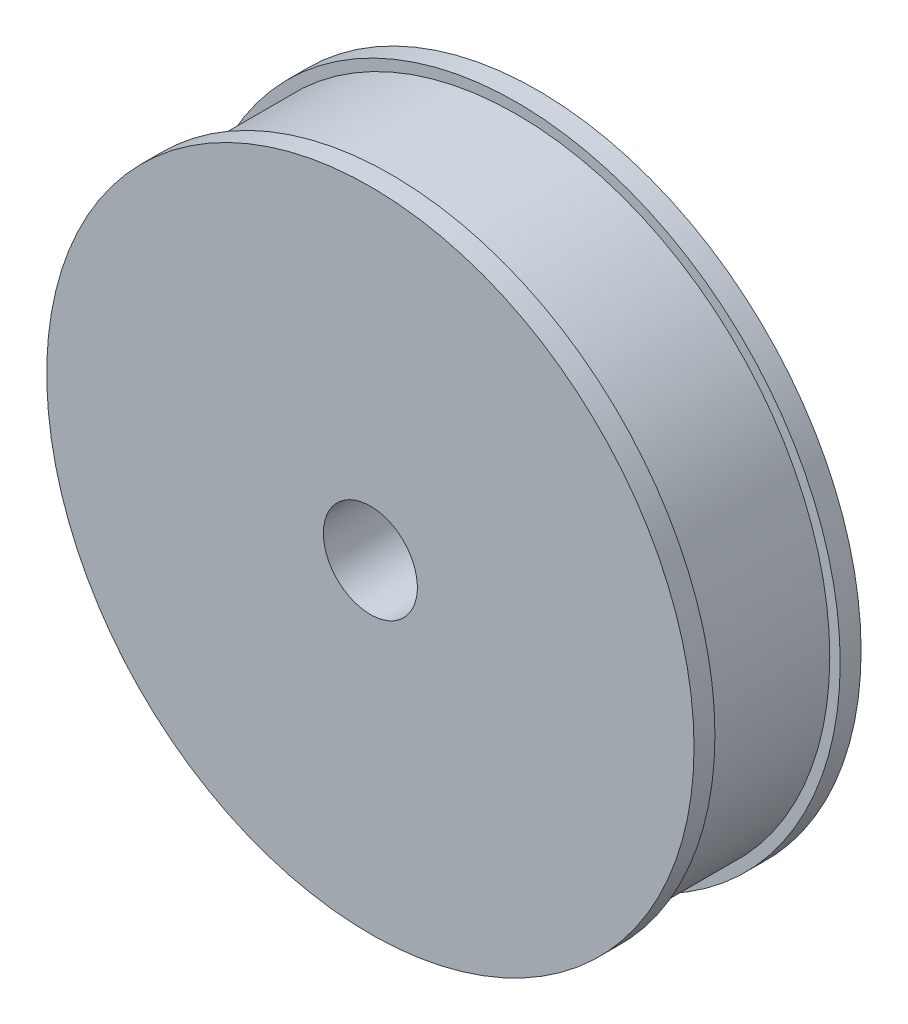
ISO-10303-21;
HEADER;
FILE_DESCRIPTION(('STEP AP214'),'2;1');
FILE_NAME('part.step','',(''),(''),'','','');
FILE_SCHEMA(('AUTOMOTIVE_DESIGN { 1 0 10303 214 1 1 1 1 }'));
ENDSEC;
DATA;
#1=APPLICATION_CONTEXT('core data for automotive mechanical design processes');
#2=APPLICATION_PROTOCOL_DEFINITION('international standard','automotive_design',2000,#1);
#3=PRODUCT_CONTEXT('',#1,'mechanical');
#4=PRODUCT('Part','Part','',(#3));
#5=PRODUCT_RELATED_PRODUCT_CATEGORY('part','',(#4));
#6=PRODUCT_DEFINITION_FORMATION('','',#4);
#7=PRODUCT_DEFINITION_CONTEXT('part definition',#1,'design');
#8=PRODUCT_DEFINITION('design','',#6,#7);
#9=PRODUCT_DEFINITION_SHAPE('','',#8);
#10=(LENGTH_UNIT() NAMED_UNIT(*) SI_UNIT(.MILLI.,.METRE.));
#11=(NAMED_UNIT(*) PLANE_ANGLE_UNIT() SI_UNIT($,.RADIAN.));
#12=(NAMED_UNIT(*) SI_UNIT($,.STERADIAN.) SOLID_ANGLE_UNIT());
#13=UNCERTAINTY_MEASURE_WITH_UNIT(LENGTH_MEASURE(1.E-05),#10,'distance_accuracy_value','');
#14=(GEOMETRIC_REPRESENTATION_CONTEXT(3) GLOBAL_UNCERTAINTY_ASSIGNED_CONTEXT((#13)) GLOBAL_UNIT_ASSIGNED_CONTEXT((#10,
#11,#12)) REPRESENTATION_CONTEXT('',''));
#15=CARTESIAN_POINT('',(0.,0.,0.));
#16=DIRECTION('',(0.,0.,1.));
#17=DIRECTION('',(1.,0.,0.));
#18=AXIS2_PLACEMENT_3D('',#15,#16,#17);
#19=CARTESIAN_POINT('',(0.,0.,2.));
#20=DIRECTION('',(0.,0.,1.));
#21=DIRECTION('',(1.,0.,0.));
#22=AXIS2_PLACEMENT_3D('',#19,#20,#21);
#23=PLANE('',#22);
#24=CARTESIAN_POINT('',(0.,0.,2.));
#25=DIRECTION('',(0.,0.,1.));
#26=DIRECTION('',(1.,0.,0.));
#27=AXIS2_PLACEMENT_3D('',#24,#25,#26);
#28=CIRCLE('',#27,31.);
#29=CARTESIAN_POINT('',(31.,0.,2.));
#30=VERTEX_POINT('',#29);
#31=EDGE_CURVE('E10',#30,#30,#28,.T.);
#32=ORIENTED_EDGE('',*,*,#31,.T.);
#33=EDGE_LOOP('',(#32));
#34=FACE_BOUND('',#33,.T.);
#35=CARTESIAN_POINT('',(0.,0.,2.));
#36=DIRECTION('',(0.,0.,1.));
#37=DIRECTION('',(1.,0.,0.));
#38=AXIS2_PLACEMENT_3D('',#35,#36,#37);
#39=CIRCLE('',#38,30.);
#40=CARTESIAN_POINT('',(30.,0.,2.));
#41=VERTEX_POINT('',#40);
#42=EDGE_CURVE('E43',#41,#41,#39,.T.);
#43=ORIENTED_EDGE('',*,*,#42,.F.);
#44=EDGE_LOOP('',(#43));
#45=FACE_BOUND('',#44,.T.);
#46=ADVANCED_FACE('F28',(#34,#45),#23,.T.);
#47=CARTESIAN_POINT('',(0.,0.,2.));
#48=DIRECTION('',(0.,0.,-1.));
#49=DIRECTION('',(-1.,0.,0.));
#50=AXIS2_PLACEMENT_3D('',#47,#48,#49);
#51=CYLINDRICAL_SURFACE('',#50,31.);
#52=ORIENTED_EDGE('',*,*,#31,.F.);
#53=EDGE_LOOP('',(#52));
#54=FACE_BOUND('',#53,.T.);
#55=CARTESIAN_POINT('',(0.,0.,0.));
#56=DIRECTION('',(0.,0.,1.));
#57=DIRECTION('',(1.,0.,0.));
#58=AXIS2_PLACEMENT_3D('',#55,#56,#57);
#59=CIRCLE('',#58,31.);
#60=CARTESIAN_POINT('',(31.,0.,0.));
#61=VERTEX_POINT('',#60);
#62=EDGE_CURVE('E35',#61,#61,#59,.T.);
#63=ORIENTED_EDGE('',*,*,#62,.T.);
#64=EDGE_LOOP('',(#63));
#65=FACE_BOUND('',#64,.T.);
#66=ADVANCED_FACE('F30',(#54,#65),#51,.T.);
#67=CARTESIAN_POINT('',(0.,0.,0.));
#68=DIRECTION('',(0.,0.,1.));
#69=DIRECTION('',(1.,0.,0.));
#70=AXIS2_PLACEMENT_3D('',#67,#68,#69);
#71=PLANE('',#70);
#72=CARTESIAN_POINT('',(0.,0.,0.));
#73=DIRECTION('',(0.,0.,-1.));
#74=DIRECTION('',(-1.,0.,0.));
#75=AXIS2_PLACEMENT_3D('',#72,#73,#74);
#76=CIRCLE('',#75,4.5);
#77=CARTESIAN_POINT('',(-4.5,0.,0.));
#78=VERTEX_POINT('',#77);
#79=EDGE_CURVE('E57',#78,#78,#76,.T.);
#80=ORIENTED_EDGE('',*,*,#79,.F.);
#81=EDGE_LOOP('',(#80));
#82=FACE_BOUND('',#81,.T.);
#83=ORIENTED_EDGE('',*,*,#62,.F.);
#84=EDGE_LOOP('',(#83));
#85=FACE_BOUND('',#84,.T.);
#86=ADVANCED_FACE('F63',(#82,#85),#71,.F.);
#87=CARTESIAN_POINT('',(0.,0.,14.));
#88=DIRECTION('',(0.,0.,-1.));
#89=DIRECTION('',(-1.,0.,0.));
#90=AXIS2_PLACEMENT_3D('',#87,#88,#89);
#91=CYLINDRICAL_SURFACE('',#90,30.);
#92=CARTESIAN_POINT('',(0.,0.,14.));
#93=DIRECTION('',(0.,0.,1.));
#94=DIRECTION('',(1.,0.,0.));
#95=AXIS2_PLACEMENT_3D('',#92,#93,#94);
#96=CIRCLE('',#95,30.);
#97=CARTESIAN_POINT('',(30.,0.,14.));
#98=VERTEX_POINT('',#97);
#99=EDGE_CURVE('E39',#98,#98,#96,.T.);
#100=ORIENTED_EDGE('',*,*,#99,.F.);
#101=EDGE_LOOP('',(#100));
#102=FACE_BOUND('',#101,.T.);
#103=ORIENTED_EDGE('',*,*,#42,.T.);
#104=EDGE_LOOP('',(#103));
#105=FACE_BOUND('',#104,.T.);
#106=ADVANCED_FACE('F66',(#102,#105),#91,.T.);
#107=CARTESIAN_POINT('',(0.,0.,14.));
#108=DIRECTION('',(0.,0.,1.));
#109=DIRECTION('',(1.,0.,0.));
#110=AXIS2_PLACEMENT_3D('',#107,#108,#109);
#111=PLANE('',#110);
#112=CARTESIAN_POINT('',(0.,0.,14.));
#113=DIRECTION('',(0.,0.,1.));
#114=DIRECTION('',(1.,0.,0.));
#115=AXIS2_PLACEMENT_3D('',#112,#113,#114);
#116=CIRCLE('',#115,31.);
#117=CARTESIAN_POINT('',(31.,0.,14.));
#118=VERTEX_POINT('',#117);
#119=EDGE_CURVE('E51',#118,#118,#116,.T.);
#120=ORIENTED_EDGE('',*,*,#119,.F.);
#121=EDGE_LOOP('',(#120));
#122=FACE_BOUND('',#121,.T.);
#123=ORIENTED_EDGE('',*,*,#99,.T.);
#124=EDGE_LOOP('',(#123));
#125=FACE_BOUND('',#124,.T.);
#126=ADVANCED_FACE('F72',(#122,#125),#111,.F.);
#127=CARTESIAN_POINT('',(0.,0.,16.));
#128=DIRECTION('',(0.,0.,-1.));
#129=DIRECTION('',(-1.,0.,0.));
#130=AXIS2_PLACEMENT_3D('',#127,#128,#129);
#131=CYLINDRICAL_SURFACE('',#130,31.);
#132=CARTESIAN_POINT('',(0.,0.,16.));
#133=DIRECTION('',(0.,0.,1.));
#134=DIRECTION('',(1.,0.,0.));
#135=AXIS2_PLACEMENT_3D('',#132,#133,#134);
#136=CIRCLE('',#135,31.);
#137=CARTESIAN_POINT('',(31.,0.,16.));
#138=VERTEX_POINT('',#137);
#139=EDGE_CURVE('E48',#138,#138,#136,.T.);
#140=ORIENTED_EDGE('',*,*,#139,.F.);
#141=EDGE_LOOP('',(#140));
#142=FACE_BOUND('',#141,.T.);
#143=ORIENTED_EDGE('',*,*,#119,.T.);
#144=EDGE_LOOP('',(#143));
#145=FACE_BOUND('',#144,.T.);
#146=ADVANCED_FACE('F109',(#142,#145),#131,.T.);
#147=CARTESIAN_POINT('',(0.,0.,16.));
#148=DIRECTION('',(0.,0.,1.));
#149=DIRECTION('',(1.,0.,0.));
#150=AXIS2_PLACEMENT_3D('',#147,#148,#149);
#151=PLANE('',#150);
#152=CARTESIAN_POINT('',(0.,0.,16.));
#153=DIRECTION('',(0.,0.,-1.));
#154=DIRECTION('',(-1.,0.,0.));
#155=AXIS2_PLACEMENT_3D('',#152,#153,#154);
#156=CIRCLE('',#155,4.5);
#157=CARTESIAN_POINT('',(-4.5,0.,16.));
#158=VERTEX_POINT('',#157);
#159=EDGE_CURVE('E54',#158,#158,#156,.T.);
#160=ORIENTED_EDGE('',*,*,#159,.T.);
#161=EDGE_LOOP('',(#160));
#162=FACE_BOUND('',#161,.T.);
#163=ORIENTED_EDGE('',*,*,#139,.T.);
#164=EDGE_LOOP('',(#163));
#165=FACE_BOUND('',#164,.T.);
#166=ADVANCED_FACE('F117',(#162,#165),#151,.T.);
#167=CARTESIAN_POINT('',(0.,0.,16.));
#168=DIRECTION('',(0.,0.,-1.));
#169=DIRECTION('',(-1.,0.,0.));
#170=AXIS2_PLACEMENT_3D('',#167,#168,#169);
#171=CYLINDRICAL_SURFACE('',#170,4.5);
#172=ORIENTED_EDGE('',*,*,#159,.F.);
#173=EDGE_LOOP('',(#172));
#174=FACE_BOUND('',#173,.T.);
#175=ORIENTED_EDGE('',*,*,#79,.T.);
#176=EDGE_LOOP('',(#175));
#177=FACE_BOUND('',#176,.T.);
#178=ADVANCED_FACE('F61',(#174,#177),#171,.F.);
#179=CLOSED_SHELL('',(#46,#66,#86,#106,#126,#146,#166,#178));
#180=MANIFOLD_SOLID_BREP('B2',#179);
#181=ADVANCED_BREP_SHAPE_REPRESENTATION('',(#18,#180),#14);
#182=SHAPE_DEFINITION_REPRESENTATION(#9,#181);
ENDSEC;
END-ISO-10303-21;
